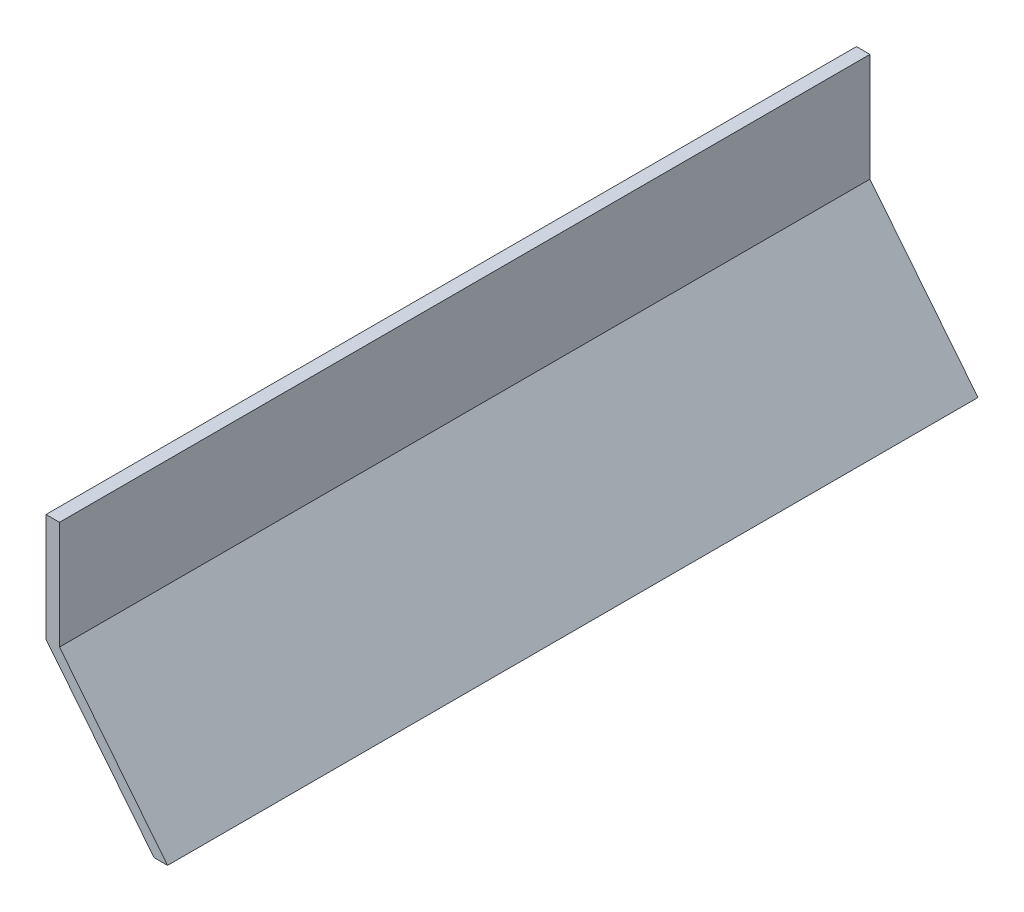
ISO-10303-21;
HEADER;
FILE_DESCRIPTION(('STEP AP214'),'2;1');
FILE_NAME('part.step','',(''),(''),'','','');
FILE_SCHEMA(('AUTOMOTIVE_DESIGN { 1 0 10303 214 1 1 1 1 }'));
ENDSEC;
DATA;
#1=APPLICATION_CONTEXT('core data for automotive mechanical design processes');
#2=APPLICATION_PROTOCOL_DEFINITION('international standard','automotive_design',2000,#1);
#3=PRODUCT_CONTEXT('',#1,'mechanical');
#4=PRODUCT('Part','Part','',(#3));
#5=PRODUCT_RELATED_PRODUCT_CATEGORY('part','',(#4));
#6=PRODUCT_DEFINITION_FORMATION('','',#4);
#7=PRODUCT_DEFINITION_CONTEXT('part definition',#1,'design');
#8=PRODUCT_DEFINITION('design','',#6,#7);
#9=PRODUCT_DEFINITION_SHAPE('','',#8);
#10=(LENGTH_UNIT() NAMED_UNIT(*) SI_UNIT(.MILLI.,.METRE.));
#11=(NAMED_UNIT(*) PLANE_ANGLE_UNIT() SI_UNIT($,.RADIAN.));
#12=(NAMED_UNIT(*) SI_UNIT($,.STERADIAN.) SOLID_ANGLE_UNIT());
#13=UNCERTAINTY_MEASURE_WITH_UNIT(LENGTH_MEASURE(1.E-05),#10,'distance_accuracy_value','');
#14=(GEOMETRIC_REPRESENTATION_CONTEXT(3) GLOBAL_UNCERTAINTY_ASSIGNED_CONTEXT((#13)) GLOBAL_UNIT_ASSIGNED_CONTEXT((#10,
#11,#12)) REPRESENTATION_CONTEXT('',''));
#15=CARTESIAN_POINT('',(0.,0.,0.));
#16=DIRECTION('',(0.,0.,1.));
#17=DIRECTION('',(1.,0.,0.));
#18=AXIS2_PLACEMENT_3D('',#15,#16,#17);
#19=CARTESIAN_POINT('',(0.,0.,30.));
#20=DIRECTION('',(0.78086880944303,0.624695047554424,0.));
#21=DIRECTION('',(-0.624695047554424,0.78086880944303,0.));
#22=AXIS2_PLACEMENT_3D('',#19,#20,#21);
#23=PLANE('',#22);
#24=DIRECTION('',(0.624695047554424,-0.78086880944303,0.));
#25=VECTOR('',#24,1.);
#26=CARTESIAN_POINT('',(0.,0.,0.));
#27=LINE('',#26,#25);
#28=CARTESIAN_POINT('',(0.,0.,0.));
#29=VERTEX_POINT('',#28);
#30=CARTESIAN_POINT('',(4.,-5.,0.));
#31=VERTEX_POINT('',#30);
#32=EDGE_CURVE('E119',#29,#31,#27,.T.);
#33=ORIENTED_EDGE('',*,*,#32,.T.);
#34=DIRECTION('',(0.,0.,-1.));
#35=VECTOR('',#34,1.);
#36=CARTESIAN_POINT('',(4.,-5.,30.));
#37=LINE('',#36,#35);
#38=CARTESIAN_POINT('',(4.,-5.,30.));
#39=VERTEX_POINT('',#38);
#40=EDGE_CURVE('E11',#39,#31,#37,.T.);
#41=ORIENTED_EDGE('',*,*,#40,.F.);
#42=DIRECTION('',(0.624695047554424,-0.78086880944303,0.));
#43=VECTOR('',#42,1.);
#44=CARTESIAN_POINT('',(0.,0.,30.));
#45=LINE('',#44,#43);
#46=CARTESIAN_POINT('',(0.,0.,30.));
#47=VERTEX_POINT('',#46);
#48=EDGE_CURVE('E129',#47,#39,#45,.T.);
#49=ORIENTED_EDGE('',*,*,#48,.F.);
#50=DIRECTION('',(0.,0.,-1.));
#51=VECTOR('',#50,1.);
#52=CARTESIAN_POINT('',(0.,0.,30.));
#53=LINE('',#52,#51);
#54=EDGE_CURVE('E115',#47,#29,#53,.T.);
#55=ORIENTED_EDGE('',*,*,#54,.T.);
#56=EDGE_LOOP('',(#33,#41,#49,#55));
#57=FACE_BOUND('',#56,.T.);
#58=ADVANCED_FACE('F35',(#57),#23,.F.);
#59=CARTESIAN_POINT('',(4.,-5.,30.));
#60=DIRECTION('',(0.,1.,0.));
#61=DIRECTION('',(0.,0.,1.));
#62=AXIS2_PLACEMENT_3D('',#59,#60,#61);
#63=PLANE('',#62);
#64=DIRECTION('',(1.,0.,0.));
#65=VECTOR('',#64,1.);
#66=CARTESIAN_POINT('',(4.,-5.,0.));
#67=LINE('',#66,#65);
#68=CARTESIAN_POINT('',(4.5,-5.,0.));
#69=VERTEX_POINT('',#68);
#70=EDGE_CURVE('E122',#31,#69,#67,.T.);
#71=ORIENTED_EDGE('',*,*,#70,.T.);
#72=DIRECTION('',(0.,0.,-1.));
#73=VECTOR('',#72,1.);
#74=CARTESIAN_POINT('',(4.5,-5.,30.));
#75=LINE('',#74,#73);
#76=CARTESIAN_POINT('',(4.5,-5.,30.));
#77=VERTEX_POINT('',#76);
#78=EDGE_CURVE('E43',#77,#69,#75,.T.);
#79=ORIENTED_EDGE('',*,*,#78,.F.);
#80=DIRECTION('',(1.,0.,0.));
#81=VECTOR('',#80,1.);
#82=CARTESIAN_POINT('',(4.,-5.,30.));
#83=LINE('',#82,#81);
#84=EDGE_CURVE('E88',#39,#77,#83,.T.);
#85=ORIENTED_EDGE('',*,*,#84,.F.);
#86=ORIENTED_EDGE('',*,*,#40,.T.);
#87=EDGE_LOOP('',(#71,#79,#85,#86));
#88=FACE_BOUND('',#87,.T.);
#89=ADVANCED_FACE('F153',(#88),#63,.F.);
#90=CARTESIAN_POINT('',(0.5,0.,30.));
#91=DIRECTION('',(-0.78086880944303,-0.624695047554424,0.));
#92=DIRECTION('',(0.624695047554424,-0.78086880944303,0.));
#93=AXIS2_PLACEMENT_3D('',#90,#91,#92);
#94=PLANE('',#93);
#95=DIRECTION('',(-0.624695047554424,0.78086880944303,0.));
#96=VECTOR('',#95,1.);
#97=CARTESIAN_POINT('',(0.5,0.,0.));
#98=LINE('',#97,#96);
#99=CARTESIAN_POINT('',(0.5,0.,0.));
#100=VERTEX_POINT('',#99);
#101=EDGE_CURVE('E124',#69,#100,#98,.T.);
#102=ORIENTED_EDGE('',*,*,#101,.T.);
#103=DIRECTION('',(0.,0.,-1.));
#104=VECTOR('',#103,1.);
#105=CARTESIAN_POINT('',(0.5,0.,30.));
#106=LINE('',#105,#104);
#107=CARTESIAN_POINT('',(0.5,0.,30.));
#108=VERTEX_POINT('',#107);
#109=EDGE_CURVE('E110',#108,#100,#106,.T.);
#110=ORIENTED_EDGE('',*,*,#109,.F.);
#111=DIRECTION('',(-0.624695047554424,0.78086880944303,0.));
#112=VECTOR('',#111,1.);
#113=CARTESIAN_POINT('',(0.5,0.,30.));
#114=LINE('',#113,#112);
#115=EDGE_CURVE('E101',#77,#108,#114,.T.);
#116=ORIENTED_EDGE('',*,*,#115,.F.);
#117=ORIENTED_EDGE('',*,*,#78,.T.);
#118=EDGE_LOOP('',(#102,#110,#116,#117));
#119=FACE_BOUND('',#118,.T.);
#120=ADVANCED_FACE('F135',(#119),#94,.F.);
#121=CARTESIAN_POINT('',(0.5,0.,30.));
#122=DIRECTION('',(-1.,0.,0.));
#123=DIRECTION('',(0.,0.,1.));
#124=AXIS2_PLACEMENT_3D('',#121,#122,#123);
#125=PLANE('',#124);
#126=DIRECTION('',(0.,1.,0.));
#127=VECTOR('',#126,1.);
#128=CARTESIAN_POINT('',(0.5,0.,0.));
#129=LINE('',#128,#127);
#130=CARTESIAN_POINT('',(0.5,4.,0.));
#131=VERTEX_POINT('',#130);
#132=EDGE_CURVE('E109',#100,#131,#129,.T.);
#133=ORIENTED_EDGE('',*,*,#132,.T.);
#134=DIRECTION('',(0.,0.,-1.));
#135=VECTOR('',#134,1.);
#136=CARTESIAN_POINT('',(0.5,4.,30.));
#137=LINE('',#136,#135);
#138=CARTESIAN_POINT('',(0.5,4.,30.));
#139=VERTEX_POINT('',#138);
#140=EDGE_CURVE('E106',#139,#131,#137,.T.);
#141=ORIENTED_EDGE('',*,*,#140,.F.);
#142=DIRECTION('',(0.,1.,0.));
#143=VECTOR('',#142,1.);
#144=CARTESIAN_POINT('',(0.5,0.,30.));
#145=LINE('',#144,#143);
#146=EDGE_CURVE('E95',#108,#139,#145,.T.);
#147=ORIENTED_EDGE('',*,*,#146,.F.);
#148=ORIENTED_EDGE('',*,*,#109,.T.);
#149=EDGE_LOOP('',(#133,#141,#147,#148));
#150=FACE_BOUND('',#149,.T.);
#151=ADVANCED_FACE('F107',(#150),#125,.F.);
#152=CARTESIAN_POINT('',(0.,4.,30.));
#153=DIRECTION('',(0.,-1.,0.));
#154=DIRECTION('',(0.,0.,-1.));
#155=AXIS2_PLACEMENT_3D('',#152,#153,#154);
#156=PLANE('',#155);
#157=DIRECTION('',(-1.,0.,0.));
#158=VECTOR('',#157,1.);
#159=CARTESIAN_POINT('',(0.,4.,0.));
#160=LINE('',#159,#158);
#161=CARTESIAN_POINT('',(0.,4.,0.));
#162=VERTEX_POINT('',#161);
#163=EDGE_CURVE('E74',#131,#162,#160,.T.);
#164=ORIENTED_EDGE('',*,*,#163,.T.);
#165=DIRECTION('',(0.,0.,-1.));
#166=VECTOR('',#165,1.);
#167=CARTESIAN_POINT('',(0.,4.,30.));
#168=LINE('',#167,#166);
#169=CARTESIAN_POINT('',(0.,4.,30.));
#170=VERTEX_POINT('',#169);
#171=EDGE_CURVE('E111',#170,#162,#168,.T.);
#172=ORIENTED_EDGE('',*,*,#171,.F.);
#173=DIRECTION('',(-1.,0.,0.));
#174=VECTOR('',#173,1.);
#175=CARTESIAN_POINT('',(0.,4.,30.));
#176=LINE('',#175,#174);
#177=EDGE_CURVE('E99',#139,#170,#176,.T.);
#178=ORIENTED_EDGE('',*,*,#177,.F.);
#179=ORIENTED_EDGE('',*,*,#140,.T.);
#180=EDGE_LOOP('',(#164,#172,#178,#179));
#181=FACE_BOUND('',#180,.T.);
#182=ADVANCED_FACE('F113',(#181),#156,.F.);
#183=CARTESIAN_POINT('',(0.,0.,30.));
#184=DIRECTION('',(1.,0.,0.));
#185=DIRECTION('',(0.,0.,-1.));
#186=AXIS2_PLACEMENT_3D('',#183,#184,#185);
#187=PLANE('',#186);
#188=DIRECTION('',(0.,-1.,0.));
#189=VECTOR('',#188,1.);
#190=CARTESIAN_POINT('',(0.,0.,0.));
#191=LINE('',#190,#189);
#192=EDGE_CURVE('E80',#162,#29,#191,.T.);
#193=ORIENTED_EDGE('',*,*,#192,.T.);
#194=ORIENTED_EDGE('',*,*,#54,.F.);
#195=DIRECTION('',(0.,-1.,0.));
#196=VECTOR('',#195,1.);
#197=CARTESIAN_POINT('',(0.,0.,30.));
#198=LINE('',#197,#196);
#199=EDGE_CURVE('E51',#170,#47,#198,.T.);
#200=ORIENTED_EDGE('',*,*,#199,.F.);
#201=ORIENTED_EDGE('',*,*,#171,.T.);
#202=EDGE_LOOP('',(#193,#194,#200,#201));
#203=FACE_BOUND('',#202,.T.);
#204=ADVANCED_FACE('F142',(#203),#187,.F.);
#205=CARTESIAN_POINT('',(0.,0.,30.));
#206=DIRECTION('',(0.,0.,1.));
#207=DIRECTION('',(1.,0.,0.));
#208=AXIS2_PLACEMENT_3D('',#205,#206,#207);
#209=PLANE('',#208);
#210=ORIENTED_EDGE('',*,*,#48,.T.);
#211=ORIENTED_EDGE('',*,*,#84,.T.);
#212=ORIENTED_EDGE('',*,*,#115,.T.);
#213=ORIENTED_EDGE('',*,*,#146,.T.);
#214=ORIENTED_EDGE('',*,*,#177,.T.);
#215=ORIENTED_EDGE('',*,*,#199,.T.);
#216=EDGE_LOOP('',(#210,#211,#212,#213,#214,#215));
#217=FACE_BOUND('',#216,.T.);
#218=ADVANCED_FACE('F97',(#217),#209,.T.);
#219=CARTESIAN_POINT('',(0.,0.,0.));
#220=DIRECTION('',(0.,0.,1.));
#221=DIRECTION('',(1.,0.,0.));
#222=AXIS2_PLACEMENT_3D('',#219,#220,#221);
#223=PLANE('',#222);
#224=ORIENTED_EDGE('',*,*,#32,.F.);
#225=ORIENTED_EDGE('',*,*,#192,.F.);
#226=ORIENTED_EDGE('',*,*,#163,.F.);
#227=ORIENTED_EDGE('',*,*,#132,.F.);
#228=ORIENTED_EDGE('',*,*,#101,.F.);
#229=ORIENTED_EDGE('',*,*,#70,.F.);
#230=EDGE_LOOP('',(#224,#225,#226,#227,#228,#229));
#231=FACE_BOUND('',#230,.T.);
#232=ADVANCED_FACE('F138',(#231),#223,.F.);
#233=CLOSED_SHELL('',(#58,#89,#120,#151,#182,#204,#218,#232));
#234=MANIFOLD_SOLID_BREP('B2',#233);
#235=ADVANCED_BREP_SHAPE_REPRESENTATION('',(#18,#234),#14);
#236=SHAPE_DEFINITION_REPRESENTATION(#9,#235);
ENDSEC;
END-ISO-10303-21;
